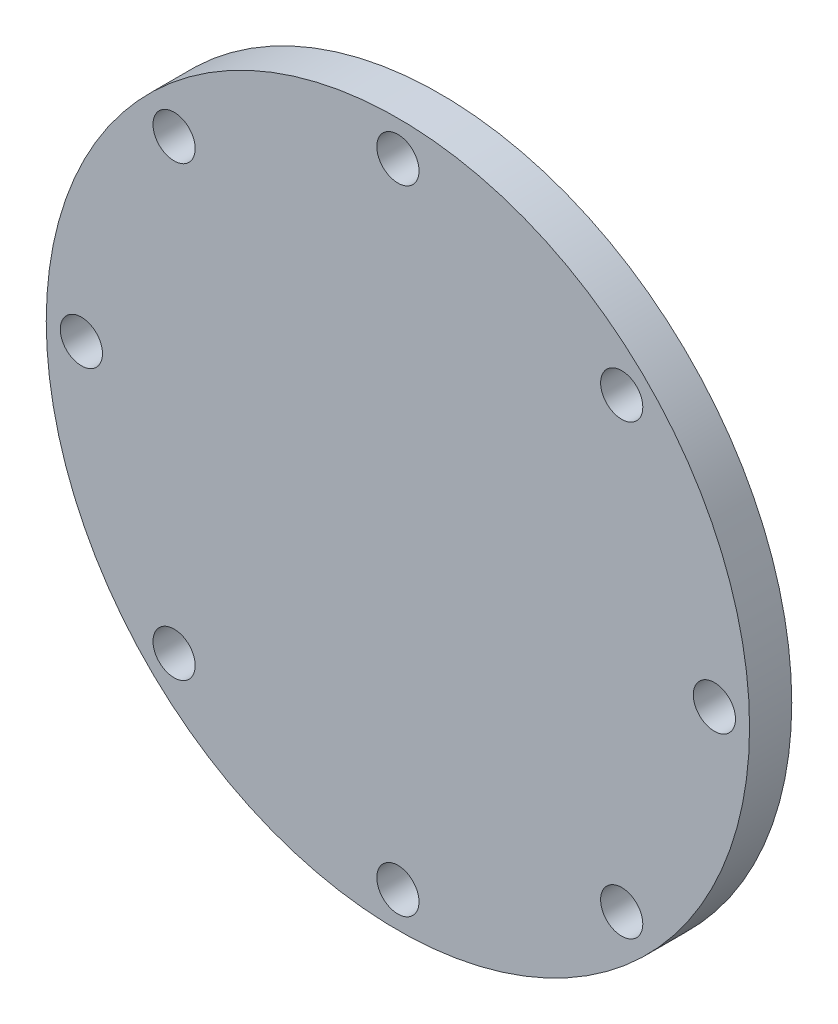
ISO-10303-21;
HEADER;
FILE_DESCRIPTION(('STEP AP214'),'2;1');
FILE_NAME('part.step','',(''),(''),'','','');
FILE_SCHEMA(('AUTOMOTIVE_DESIGN { 1 0 10303 214 1 1 1 1 }'));
ENDSEC;
DATA;
#1=APPLICATION_CONTEXT('core data for automotive mechanical design processes');
#2=APPLICATION_PROTOCOL_DEFINITION('international standard','automotive_design',2000,#1);
#3=PRODUCT_CONTEXT('',#1,'mechanical');
#4=PRODUCT('Part','Part','',(#3));
#5=PRODUCT_RELATED_PRODUCT_CATEGORY('part','',(#4));
#6=PRODUCT_DEFINITION_FORMATION('','',#4);
#7=PRODUCT_DEFINITION_CONTEXT('part definition',#1,'design');
#8=PRODUCT_DEFINITION('design','',#6,#7);
#9=PRODUCT_DEFINITION_SHAPE('','',#8);
#10=(LENGTH_UNIT() NAMED_UNIT(*) SI_UNIT(.MILLI.,.METRE.));
#11=(NAMED_UNIT(*) PLANE_ANGLE_UNIT() SI_UNIT($,.RADIAN.));
#12=(NAMED_UNIT(*) SI_UNIT($,.STERADIAN.) SOLID_ANGLE_UNIT());
#13=UNCERTAINTY_MEASURE_WITH_UNIT(LENGTH_MEASURE(1.E-05),#10,'distance_accuracy_value','');
#14=(GEOMETRIC_REPRESENTATION_CONTEXT(3) GLOBAL_UNCERTAINTY_ASSIGNED_CONTEXT((#13)) GLOBAL_UNIT_ASSIGNED_CONTEXT((#10,
#11,#12)) REPRESENTATION_CONTEXT('',''));
#15=CARTESIAN_POINT('',(0.,0.,0.));
#16=DIRECTION('',(0.,0.,1.));
#17=DIRECTION('',(1.,0.,0.));
#18=AXIS2_PLACEMENT_3D('',#15,#16,#17);
#19=CARTESIAN_POINT('',(0.,0.,3.));
#20=DIRECTION('',(0.,0.,1.));
#21=DIRECTION('',(1.,0.,0.));
#22=AXIS2_PLACEMENT_3D('',#19,#20,#21);
#23=PLANE('',#22);
#24=CARTESIAN_POINT('',(-22.5,0.,3.));
#25=DIRECTION('',(0.,0.,1.));
#26=DIRECTION('',(1.,0.,0.));
#27=AXIS2_PLACEMENT_3D('',#24,#25,#26);
#28=CIRCLE('',#27,1.5);
#29=CARTESIAN_POINT('',(-21.,0.,3.));
#30=VERTEX_POINT('',#29);
#31=EDGE_CURVE('E100',#30,#30,#28,.T.);
#32=ORIENTED_EDGE('',*,*,#31,.F.);
#33=EDGE_LOOP('',(#32));
#34=FACE_BOUND('',#33,.T.);
#35=CARTESIAN_POINT('',(0.,-22.5,3.));
#36=DIRECTION('',(0.,0.,1.));
#37=DIRECTION('',(1.,0.,0.));
#38=AXIS2_PLACEMENT_3D('',#35,#36,#37);
#39=CIRCLE('',#38,1.5);
#40=CARTESIAN_POINT('',(1.5,-22.5,3.));
#41=VERTEX_POINT('',#40);
#42=EDGE_CURVE('E84',#41,#41,#39,.T.);
#43=ORIENTED_EDGE('',*,*,#42,.F.);
#44=EDGE_LOOP('',(#43));
#45=FACE_BOUND('',#44,.T.);
#46=CARTESIAN_POINT('',(22.5,0.,3.));
#47=DIRECTION('',(0.,0.,1.));
#48=DIRECTION('',(1.,0.,0.));
#49=AXIS2_PLACEMENT_3D('',#46,#47,#48);
#50=CIRCLE('',#49,1.5);
#51=CARTESIAN_POINT('',(24.,0.,3.));
#52=VERTEX_POINT('',#51);
#53=EDGE_CURVE('E68',#52,#52,#50,.T.);
#54=ORIENTED_EDGE('',*,*,#53,.F.);
#55=EDGE_LOOP('',(#54));
#56=FACE_BOUND('',#55,.T.);
#57=CARTESIAN_POINT('',(0.,22.5,3.));
#58=DIRECTION('',(0.,0.,1.));
#59=DIRECTION('',(1.,0.,0.));
#60=AXIS2_PLACEMENT_3D('',#57,#58,#59);
#61=CIRCLE('',#60,1.5);
#62=CARTESIAN_POINT('',(1.5,22.5,3.));
#63=VERTEX_POINT('',#62);
#64=EDGE_CURVE('E54',#63,#63,#61,.T.);
#65=ORIENTED_EDGE('',*,*,#64,.F.);
#66=EDGE_LOOP('',(#65));
#67=FACE_BOUND('',#66,.T.);
#68=CARTESIAN_POINT('',(0.,0.,3.));
#69=DIRECTION('',(0.,0.,1.));
#70=DIRECTION('',(1.,0.,0.));
#71=AXIS2_PLACEMENT_3D('',#68,#69,#70);
#72=CIRCLE('',#71,25.);
#73=CARTESIAN_POINT('',(25.,0.,3.));
#74=VERTEX_POINT('',#73);
#75=EDGE_CURVE('E10',#74,#74,#72,.T.);
#76=ORIENTED_EDGE('',*,*,#75,.T.);
#77=EDGE_LOOP('',(#76));
#78=FACE_BOUND('',#77,.T.);
#79=CARTESIAN_POINT('',(15.9099025766973,15.9099025766973,3.));
#80=DIRECTION('',(0.,0.,1.));
#81=DIRECTION('',(1.,0.,0.));
#82=AXIS2_PLACEMENT_3D('',#79,#80,#81);
#83=CIRCLE('',#82,1.5);
#84=CARTESIAN_POINT('',(17.4099025766973,15.9099025766973,3.));
#85=VERTEX_POINT('',#84);
#86=EDGE_CURVE('E60',#85,#85,#83,.T.);
#87=ORIENTED_EDGE('',*,*,#86,.F.);
#88=EDGE_LOOP('',(#87));
#89=FACE_BOUND('',#88,.T.);
#90=CARTESIAN_POINT('',(15.9099025766973,-15.9099025766973,3.));
#91=DIRECTION('',(0.,0.,1.));
#92=DIRECTION('',(1.,0.,0.));
#93=AXIS2_PLACEMENT_3D('',#90,#91,#92);
#94=CIRCLE('',#93,1.5);
#95=CARTESIAN_POINT('',(17.4099025766973,-15.9099025766973,3.));
#96=VERTEX_POINT('',#95);
#97=EDGE_CURVE('E76',#96,#96,#94,.T.);
#98=ORIENTED_EDGE('',*,*,#97,.F.);
#99=EDGE_LOOP('',(#98));
#100=FACE_BOUND('',#99,.T.);
#101=CARTESIAN_POINT('',(-15.9099025766973,-15.9099025766973,3.));
#102=DIRECTION('',(0.,0.,1.));
#103=DIRECTION('',(1.,0.,0.));
#104=AXIS2_PLACEMENT_3D('',#101,#102,#103);
#105=CIRCLE('',#104,1.5);
#106=CARTESIAN_POINT('',(-14.4099025766973,-15.9099025766973,3.));
#107=VERTEX_POINT('',#106);
#108=EDGE_CURVE('E92',#107,#107,#105,.T.);
#109=ORIENTED_EDGE('',*,*,#108,.F.);
#110=EDGE_LOOP('',(#109));
#111=FACE_BOUND('',#110,.T.);
#112=CARTESIAN_POINT('',(-15.9099025766973,15.9099025766973,3.));
#113=DIRECTION('',(0.,0.,1.));
#114=DIRECTION('',(1.,0.,0.));
#115=AXIS2_PLACEMENT_3D('',#112,#113,#114);
#116=CIRCLE('',#115,1.5);
#117=CARTESIAN_POINT('',(-14.4099025766973,15.9099025766973,3.));
#118=VERTEX_POINT('',#117);
#119=EDGE_CURVE('E108',#118,#118,#116,.T.);
#120=ORIENTED_EDGE('',*,*,#119,.F.);
#121=EDGE_LOOP('',(#120));
#122=FACE_BOUND('',#121,.T.);
#123=ADVANCED_FACE('F41',(#34,#45,#56,#67,#78,#89,#100,#111,#122),#23,.T.);
#124=CARTESIAN_POINT('',(0.,0.,0.));
#125=DIRECTION('',(0.,0.,1.));
#126=DIRECTION('',(1.,0.,0.));
#127=AXIS2_PLACEMENT_3D('',#124,#125,#126);
#128=PLANE('',#127);
#129=CARTESIAN_POINT('',(0.,0.,0.));
#130=DIRECTION('',(0.,0.,1.));
#131=DIRECTION('',(1.,0.,0.));
#132=AXIS2_PLACEMENT_3D('',#129,#130,#131);
#133=CIRCLE('',#132,25.);
#134=CARTESIAN_POINT('',(25.,0.,0.));
#135=VERTEX_POINT('',#134);
#136=EDGE_CURVE('E45',#135,#135,#133,.T.);
#137=ORIENTED_EDGE('',*,*,#136,.F.);
#138=EDGE_LOOP('',(#137));
#139=FACE_BOUND('',#138,.T.);
#140=CARTESIAN_POINT('',(0.,22.5,0.));
#141=DIRECTION('',(0.,0.,1.));
#142=DIRECTION('',(1.,0.,0.));
#143=AXIS2_PLACEMENT_3D('',#140,#141,#142);
#144=CIRCLE('',#143,1.5);
#145=CARTESIAN_POINT('',(1.5,22.5,0.));
#146=VERTEX_POINT('',#145);
#147=EDGE_CURVE('E56',#146,#146,#144,.T.);
#148=ORIENTED_EDGE('',*,*,#147,.T.);
#149=EDGE_LOOP('',(#148));
#150=FACE_BOUND('',#149,.T.);
#151=CARTESIAN_POINT('',(15.9099025766973,15.9099025766973,0.));
#152=DIRECTION('',(0.,0.,1.));
#153=DIRECTION('',(1.,0.,0.));
#154=AXIS2_PLACEMENT_3D('',#151,#152,#153);
#155=CIRCLE('',#154,1.5);
#156=CARTESIAN_POINT('',(17.4099025766973,15.9099025766973,0.));
#157=VERTEX_POINT('',#156);
#158=EDGE_CURVE('E64',#157,#157,#155,.T.);
#159=ORIENTED_EDGE('',*,*,#158,.T.);
#160=EDGE_LOOP('',(#159));
#161=FACE_BOUND('',#160,.T.);
#162=CARTESIAN_POINT('',(22.5,0.,0.));
#163=DIRECTION('',(0.,0.,1.));
#164=DIRECTION('',(1.,0.,0.));
#165=AXIS2_PLACEMENT_3D('',#162,#163,#164);
#166=CIRCLE('',#165,1.5);
#167=CARTESIAN_POINT('',(24.,0.,0.));
#168=VERTEX_POINT('',#167);
#169=EDGE_CURVE('E72',#168,#168,#166,.T.);
#170=ORIENTED_EDGE('',*,*,#169,.T.);
#171=EDGE_LOOP('',(#170));
#172=FACE_BOUND('',#171,.T.);
#173=CARTESIAN_POINT('',(15.9099025766973,-15.9099025766973,0.));
#174=DIRECTION('',(0.,0.,1.));
#175=DIRECTION('',(1.,0.,0.));
#176=AXIS2_PLACEMENT_3D('',#173,#174,#175);
#177=CIRCLE('',#176,1.5);
#178=CARTESIAN_POINT('',(17.4099025766973,-15.9099025766973,0.));
#179=VERTEX_POINT('',#178);
#180=EDGE_CURVE('E80',#179,#179,#177,.T.);
#181=ORIENTED_EDGE('',*,*,#180,.T.);
#182=EDGE_LOOP('',(#181));
#183=FACE_BOUND('',#182,.T.);
#184=CARTESIAN_POINT('',(0.,-22.5,0.));
#185=DIRECTION('',(0.,0.,1.));
#186=DIRECTION('',(1.,0.,0.));
#187=AXIS2_PLACEMENT_3D('',#184,#185,#186);
#188=CIRCLE('',#187,1.5);
#189=CARTESIAN_POINT('',(1.5,-22.5,0.));
#190=VERTEX_POINT('',#189);
#191=EDGE_CURVE('E88',#190,#190,#188,.T.);
#192=ORIENTED_EDGE('',*,*,#191,.T.);
#193=EDGE_LOOP('',(#192));
#194=FACE_BOUND('',#193,.T.);
#195=CARTESIAN_POINT('',(-15.9099025766973,-15.9099025766973,0.));
#196=DIRECTION('',(0.,0.,1.));
#197=DIRECTION('',(1.,0.,0.));
#198=AXIS2_PLACEMENT_3D('',#195,#196,#197);
#199=CIRCLE('',#198,1.5);
#200=CARTESIAN_POINT('',(-14.4099025766973,-15.9099025766973,0.));
#201=VERTEX_POINT('',#200);
#202=EDGE_CURVE('E96',#201,#201,#199,.T.);
#203=ORIENTED_EDGE('',*,*,#202,.T.);
#204=EDGE_LOOP('',(#203));
#205=FACE_BOUND('',#204,.T.);
#206=CARTESIAN_POINT('',(-22.5,0.,0.));
#207=DIRECTION('',(0.,0.,1.));
#208=DIRECTION('',(1.,0.,0.));
#209=AXIS2_PLACEMENT_3D('',#206,#207,#208);
#210=CIRCLE('',#209,1.5);
#211=CARTESIAN_POINT('',(-21.,0.,0.));
#212=VERTEX_POINT('',#211);
#213=EDGE_CURVE('E104',#212,#212,#210,.T.);
#214=ORIENTED_EDGE('',*,*,#213,.T.);
#215=EDGE_LOOP('',(#214));
#216=FACE_BOUND('',#215,.T.);
#217=CARTESIAN_POINT('',(-15.9099025766973,15.9099025766973,0.));
#218=DIRECTION('',(0.,0.,1.));
#219=DIRECTION('',(1.,0.,0.));
#220=AXIS2_PLACEMENT_3D('',#217,#218,#219);
#221=CIRCLE('',#220,1.5);
#222=CARTESIAN_POINT('',(-14.4099025766973,15.9099025766973,0.));
#223=VERTEX_POINT('',#222);
#224=EDGE_CURVE('E112',#223,#223,#221,.T.);
#225=ORIENTED_EDGE('',*,*,#224,.T.);
#226=EDGE_LOOP('',(#225));
#227=FACE_BOUND('',#226,.T.);
#228=ADVANCED_FACE('F124',(#139,#150,#161,#172,#183,#194,#205,#216,#227),#128,.F.);
#229=CARTESIAN_POINT('',(0.,0.,3.));
#230=DIRECTION('',(0.,0.,-1.));
#231=DIRECTION('',(-1.,0.,0.));
#232=AXIS2_PLACEMENT_3D('',#229,#230,#231);
#233=CYLINDRICAL_SURFACE('',#232,25.);
#234=ORIENTED_EDGE('',*,*,#75,.F.);
#235=EDGE_LOOP('',(#234));
#236=FACE_BOUND('',#235,.T.);
#237=ORIENTED_EDGE('',*,*,#136,.T.);
#238=EDGE_LOOP('',(#237));
#239=FACE_BOUND('',#238,.T.);
#240=ADVANCED_FACE('F43',(#236,#239),#233,.T.);
#241=CARTESIAN_POINT('',(0.,22.5,3.));
#242=DIRECTION('',(0.,0.,-1.));
#243=DIRECTION('',(-1.,0.,0.));
#244=AXIS2_PLACEMENT_3D('',#241,#242,#243);
#245=CYLINDRICAL_SURFACE('',#244,1.5);
#246=ORIENTED_EDGE('',*,*,#64,.T.);
#247=EDGE_LOOP('',(#246));
#248=FACE_BOUND('',#247,.T.);
#249=ORIENTED_EDGE('',*,*,#147,.F.);
#250=EDGE_LOOP('',(#249));
#251=FACE_BOUND('',#250,.T.);
#252=ADVANCED_FACE('F134',(#248,#251),#245,.F.);
#253=CARTESIAN_POINT('',(15.9099025766973,15.9099025766973,3.));
#254=DIRECTION('',(0.,0.,-1.));
#255=DIRECTION('',(-1.,0.,0.));
#256=AXIS2_PLACEMENT_3D('',#253,#254,#255);
#257=CYLINDRICAL_SURFACE('',#256,1.5);
#258=ORIENTED_EDGE('',*,*,#86,.T.);
#259=EDGE_LOOP('',(#258));
#260=FACE_BOUND('',#259,.T.);
#261=ORIENTED_EDGE('',*,*,#158,.F.);
#262=EDGE_LOOP('',(#261));
#263=FACE_BOUND('',#262,.T.);
#264=ADVANCED_FACE('F137',(#260,#263),#257,.F.);
#265=CARTESIAN_POINT('',(22.5,0.,3.));
#266=DIRECTION('',(0.,0.,-1.));
#267=DIRECTION('',(-1.,0.,0.));
#268=AXIS2_PLACEMENT_3D('',#265,#266,#267);
#269=CYLINDRICAL_SURFACE('',#268,1.5);
#270=ORIENTED_EDGE('',*,*,#53,.T.);
#271=EDGE_LOOP('',(#270));
#272=FACE_BOUND('',#271,.T.);
#273=ORIENTED_EDGE('',*,*,#169,.F.);
#274=EDGE_LOOP('',(#273));
#275=FACE_BOUND('',#274,.T.);
#276=ADVANCED_FACE('F141',(#272,#275),#269,.F.);
#277=CARTESIAN_POINT('',(15.9099025766973,-15.9099025766973,3.));
#278=DIRECTION('',(0.,0.,-1.));
#279=DIRECTION('',(-1.,0.,0.));
#280=AXIS2_PLACEMENT_3D('',#277,#278,#279);
#281=CYLINDRICAL_SURFACE('',#280,1.5);
#282=ORIENTED_EDGE('',*,*,#97,.T.);
#283=EDGE_LOOP('',(#282));
#284=FACE_BOUND('',#283,.T.);
#285=ORIENTED_EDGE('',*,*,#180,.F.);
#286=EDGE_LOOP('',(#285));
#287=FACE_BOUND('',#286,.T.);
#288=ADVANCED_FACE('F145',(#284,#287),#281,.F.);
#289=CARTESIAN_POINT('',(0.,-22.5,3.));
#290=DIRECTION('',(0.,0.,-1.));
#291=DIRECTION('',(-1.,0.,0.));
#292=AXIS2_PLACEMENT_3D('',#289,#290,#291);
#293=CYLINDRICAL_SURFACE('',#292,1.5);
#294=ORIENTED_EDGE('',*,*,#42,.T.);
#295=EDGE_LOOP('',(#294));
#296=FACE_BOUND('',#295,.T.);
#297=ORIENTED_EDGE('',*,*,#191,.F.);
#298=EDGE_LOOP('',(#297));
#299=FACE_BOUND('',#298,.T.);
#300=ADVANCED_FACE('F149',(#296,#299),#293,.F.);
#301=CARTESIAN_POINT('',(-15.9099025766973,-15.9099025766973,3.));
#302=DIRECTION('',(0.,0.,-1.));
#303=DIRECTION('',(-1.,0.,0.));
#304=AXIS2_PLACEMENT_3D('',#301,#302,#303);
#305=CYLINDRICAL_SURFACE('',#304,1.5);
#306=ORIENTED_EDGE('',*,*,#108,.T.);
#307=EDGE_LOOP('',(#306));
#308=FACE_BOUND('',#307,.T.);
#309=ORIENTED_EDGE('',*,*,#202,.F.);
#310=EDGE_LOOP('',(#309));
#311=FACE_BOUND('',#310,.T.);
#312=ADVANCED_FACE('F153',(#308,#311),#305,.F.);
#313=CARTESIAN_POINT('',(-22.5,0.,3.));
#314=DIRECTION('',(0.,0.,-1.));
#315=DIRECTION('',(-1.,0.,0.));
#316=AXIS2_PLACEMENT_3D('',#313,#314,#315);
#317=CYLINDRICAL_SURFACE('',#316,1.5);
#318=ORIENTED_EDGE('',*,*,#31,.T.);
#319=EDGE_LOOP('',(#318));
#320=FACE_BOUND('',#319,.T.);
#321=ORIENTED_EDGE('',*,*,#213,.F.);
#322=EDGE_LOOP('',(#321));
#323=FACE_BOUND('',#322,.T.);
#324=ADVANCED_FACE('F157',(#320,#323),#317,.F.);
#325=CARTESIAN_POINT('',(-15.9099025766973,15.9099025766973,3.));
#326=DIRECTION('',(0.,0.,-1.));
#327=DIRECTION('',(-1.,0.,0.));
#328=AXIS2_PLACEMENT_3D('',#325,#326,#327);
#329=CYLINDRICAL_SURFACE('',#328,1.5);
#330=ORIENTED_EDGE('',*,*,#119,.T.);
#331=EDGE_LOOP('',(#330));
#332=FACE_BOUND('',#331,.T.);
#333=ORIENTED_EDGE('',*,*,#224,.F.);
#334=EDGE_LOOP('',(#333));
#335=FACE_BOUND('',#334,.T.);
#336=ADVANCED_FACE('F120',(#332,#335),#329,.F.);
#337=CLOSED_SHELL('',(#123,#228,#240,#252,#264,#276,#288,#300,#312,#324,#336));
#338=MANIFOLD_SOLID_BREP('B2',#337);
#339=ADVANCED_BREP_SHAPE_REPRESENTATION('',(#18,#338),#14);
#340=SHAPE_DEFINITION_REPRESENTATION(#9,#339);
ENDSEC;
END-ISO-10303-21;
